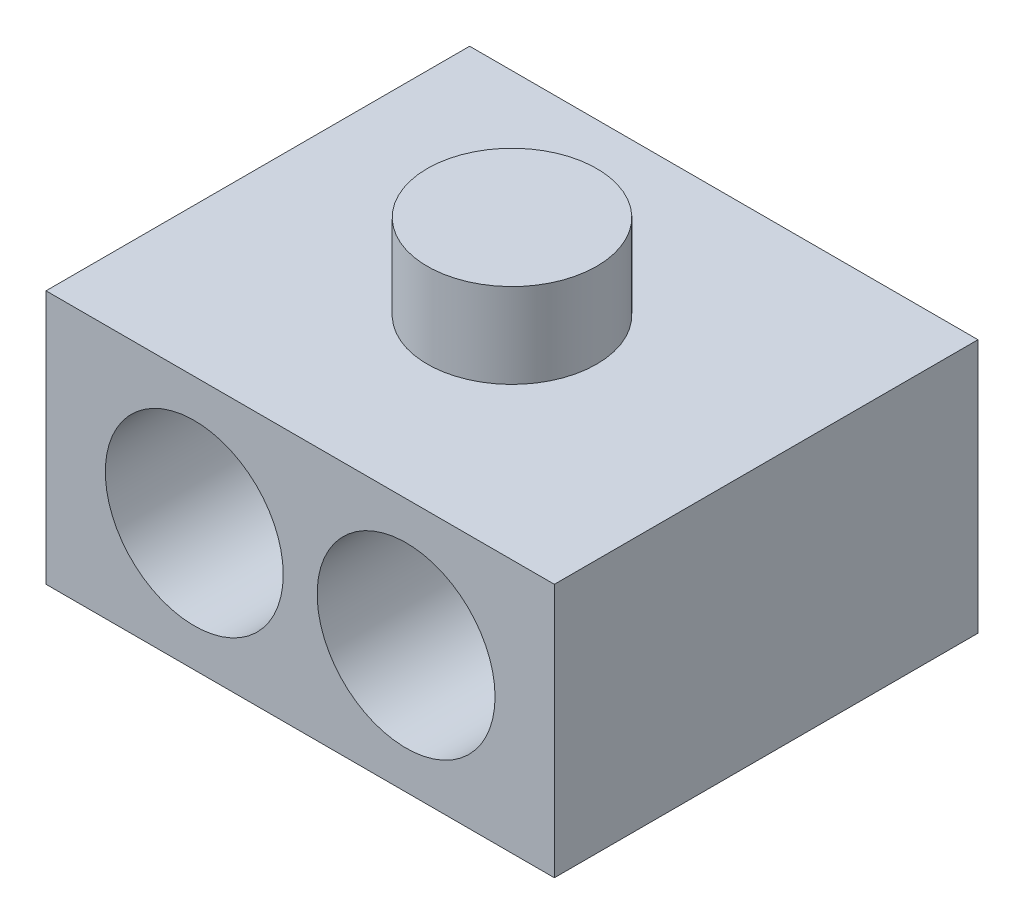
ISO-10303-21;
HEADER;
FILE_DESCRIPTION(('STEP AP214'),'2;1');
FILE_NAME('part.step','',(''),(''),'','','');
FILE_SCHEMA(('AUTOMOTIVE_DESIGN { 1 0 10303 214 1 1 1 1 }'));
ENDSEC;
DATA;
#1=APPLICATION_CONTEXT('core data for automotive mechanical design processes');
#2=APPLICATION_PROTOCOL_DEFINITION('international standard','automotive_design',2000,#1);
#3=PRODUCT_CONTEXT('',#1,'mechanical');
#4=PRODUCT('Part','Part','',(#3));
#5=PRODUCT_RELATED_PRODUCT_CATEGORY('part','',(#4));
#6=PRODUCT_DEFINITION_FORMATION('','',#4);
#7=PRODUCT_DEFINITION_CONTEXT('part definition',#1,'design');
#8=PRODUCT_DEFINITION('design','',#6,#7);
#9=PRODUCT_DEFINITION_SHAPE('','',#8);
#10=(LENGTH_UNIT() NAMED_UNIT(*) SI_UNIT(.MILLI.,.METRE.));
#11=(NAMED_UNIT(*) PLANE_ANGLE_UNIT() SI_UNIT($,.RADIAN.));
#12=(NAMED_UNIT(*) SI_UNIT($,.STERADIAN.) SOLID_ANGLE_UNIT());
#13=UNCERTAINTY_MEASURE_WITH_UNIT(LENGTH_MEASURE(1.E-05),#10,'distance_accuracy_value','');
#14=(GEOMETRIC_REPRESENTATION_CONTEXT(3) GLOBAL_UNCERTAINTY_ASSIGNED_CONTEXT((#13)) GLOBAL_UNIT_ASSIGNED_CONTEXT((#10,
#11,#12)) REPRESENTATION_CONTEXT('',''));
#15=CARTESIAN_POINT('',(0.,0.,0.));
#16=DIRECTION('',(0.,0.,1.));
#17=DIRECTION('',(1.,0.,0.));
#18=AXIS2_PLACEMENT_3D('',#15,#16,#17);
#19=CARTESIAN_POINT('',(0.,30.,10.));
#20=DIRECTION('',(0.,-1.,0.));
#21=DIRECTION('',(1.,0.,0.));
#22=AXIS2_PLACEMENT_3D('',#19,#20,#21);
#23=PLANE('',#22);
#24=CARTESIAN_POINT('',(-25.,30.,25.));
#25=DIRECTION('',(0.,1.,0.));
#26=DIRECTION('',(-1.,0.,0.));
#27=AXIS2_PLACEMENT_3D('',#24,#25,#26);
#28=CIRCLE('',#27,10.);
#29=CARTESIAN_POINT('',(-35.,30.,25.));
#30=VERTEX_POINT('',#29);
#31=EDGE_CURVE('E11',#30,#30,#28,.T.);
#32=ORIENTED_EDGE('',*,*,#31,.F.);
#33=EDGE_LOOP('',(#32));
#34=FACE_BOUND('',#33,.T.);
#35=DIRECTION('',(-1.,0.,0.));
#36=VECTOR('',#35,1.);
#37=CARTESIAN_POINT('',(0.,30.,0.));
#38=LINE('',#37,#36);
#39=CARTESIAN_POINT('',(5.,30.,0.));
#40=VERTEX_POINT('',#39);
#41=CARTESIAN_POINT('',(-55.,30.,0.));
#42=VERTEX_POINT('',#41);
#43=EDGE_CURVE('E56',#40,#42,#38,.T.);
#44=ORIENTED_EDGE('',*,*,#43,.T.);
#45=DIRECTION('',(0.,0.,-1.));
#46=VECTOR('',#45,1.);
#47=CARTESIAN_POINT('',(-55.,30.,0.));
#48=LINE('',#47,#46);
#49=CARTESIAN_POINT('',(-55.,30.,50.));
#50=VERTEX_POINT('',#49);
#51=EDGE_CURVE('E92',#50,#42,#48,.T.);
#52=ORIENTED_EDGE('',*,*,#51,.F.);
#53=DIRECTION('',(-1.,0.,0.));
#54=VECTOR('',#53,1.);
#55=CARTESIAN_POINT('',(-50.,30.,50.));
#56=LINE('',#55,#54);
#57=CARTESIAN_POINT('',(5.,30.,50.));
#58=VERTEX_POINT('',#57);
#59=EDGE_CURVE('E48',#58,#50,#56,.T.);
#60=ORIENTED_EDGE('',*,*,#59,.F.);
#61=DIRECTION('',(0.,0.,1.));
#62=VECTOR('',#61,1.);
#63=CARTESIAN_POINT('',(5.,30.,50.));
#64=LINE('',#63,#62);
#65=EDGE_CURVE('E106',#40,#58,#64,.T.);
#66=ORIENTED_EDGE('',*,*,#65,.F.);
#67=EDGE_LOOP('',(#44,#52,#60,#66));
#68=FACE_BOUND('',#67,.T.);
#69=ADVANCED_FACE('F33',(#34,#68),#23,.F.);
#70=CARTESIAN_POINT('',(0.,0.,10.));
#71=DIRECTION('',(0.,1.,0.));
#72=DIRECTION('',(0.,0.,1.));
#73=AXIS2_PLACEMENT_3D('',#70,#71,#72);
#74=PLANE('',#73);
#75=DIRECTION('',(1.,0.,0.));
#76=VECTOR('',#75,1.);
#77=CARTESIAN_POINT('',(0.,0.,0.));
#78=LINE('',#77,#76);
#79=CARTESIAN_POINT('',(-55.,0.,0.));
#80=VERTEX_POINT('',#79);
#81=CARTESIAN_POINT('',(5.,0.,0.));
#82=VERTEX_POINT('',#81);
#83=EDGE_CURVE('E36',#80,#82,#78,.T.);
#84=ORIENTED_EDGE('',*,*,#83,.T.);
#85=DIRECTION('',(0.,0.,-1.));
#86=VECTOR('',#85,1.);
#87=CARTESIAN_POINT('',(5.,0.,50.));
#88=LINE('',#87,#86);
#89=CARTESIAN_POINT('',(5.,0.,50.));
#90=VERTEX_POINT('',#89);
#91=EDGE_CURVE('E103',#90,#82,#88,.T.);
#92=ORIENTED_EDGE('',*,*,#91,.F.);
#93=DIRECTION('',(1.,0.,0.));
#94=VECTOR('',#93,1.);
#95=CARTESIAN_POINT('',(-50.,0.,50.));
#96=LINE('',#95,#94);
#97=CARTESIAN_POINT('',(-55.,0.,50.));
#98=VERTEX_POINT('',#97);
#99=EDGE_CURVE('E84',#98,#90,#96,.T.);
#100=ORIENTED_EDGE('',*,*,#99,.F.);
#101=DIRECTION('',(0.,0.,1.));
#102=VECTOR('',#101,1.);
#103=CARTESIAN_POINT('',(-55.,0.,0.));
#104=LINE('',#103,#102);
#105=EDGE_CURVE('E82',#80,#98,#104,.T.);
#106=ORIENTED_EDGE('',*,*,#105,.F.);
#107=EDGE_LOOP('',(#84,#92,#100,#106));
#108=FACE_BOUND('',#107,.T.);
#109=ADVANCED_FACE('F83',(#108),#74,.F.);
#110=CARTESIAN_POINT('',(0.,0.,0.));
#111=DIRECTION('',(0.,0.,1.));
#112=DIRECTION('',(1.,0.,0.));
#113=AXIS2_PLACEMENT_3D('',#110,#111,#112);
#114=PLANE('',#113);
#115=CARTESIAN_POINT('',(-37.5,15.,0.));
#116=DIRECTION('',(0.,0.,1.));
#117=DIRECTION('',(1.,0.,0.));
#118=AXIS2_PLACEMENT_3D('',#115,#116,#117);
#119=CIRCLE('',#118,7.5);
#120=CARTESIAN_POINT('',(-30.,15.,0.));
#121=VERTEX_POINT('',#120);
#122=EDGE_CURVE('E125',#121,#121,#119,.T.);
#123=ORIENTED_EDGE('',*,*,#122,.T.);
#124=EDGE_LOOP('',(#123));
#125=FACE_BOUND('',#124,.T.);
#126=CARTESIAN_POINT('',(-12.5,15.,0.));
#127=DIRECTION('',(0.,0.,1.));
#128=DIRECTION('',(1.,0.,0.));
#129=AXIS2_PLACEMENT_3D('',#126,#127,#128);
#130=CIRCLE('',#129,7.5);
#131=CARTESIAN_POINT('',(-5.,15.,0.));
#132=VERTEX_POINT('',#131);
#133=EDGE_CURVE('E124',#132,#132,#130,.T.);
#134=ORIENTED_EDGE('',*,*,#133,.T.);
#135=EDGE_LOOP('',(#134));
#136=FACE_BOUND('',#135,.T.);
#137=ORIENTED_EDGE('',*,*,#43,.F.);
#138=DIRECTION('',(0.,1.,0.));
#139=VECTOR('',#138,1.);
#140=CARTESIAN_POINT('',(5.,30.,0.));
#141=LINE('',#140,#139);
#142=EDGE_CURVE('E77',#82,#40,#141,.T.);
#143=ORIENTED_EDGE('',*,*,#142,.F.);
#144=ORIENTED_EDGE('',*,*,#83,.F.);
#145=DIRECTION('',(0.,-1.,0.));
#146=VECTOR('',#145,1.);
#147=CARTESIAN_POINT('',(-55.,0.,0.));
#148=LINE('',#147,#146);
#149=EDGE_CURVE('E76',#42,#80,#148,.T.);
#150=ORIENTED_EDGE('',*,*,#149,.F.);
#151=EDGE_LOOP('',(#137,#143,#144,#150));
#152=FACE_BOUND('',#151,.T.);
#153=ADVANCED_FACE('F74',(#125,#136,#152),#114,.F.);
#154=CARTESIAN_POINT('',(-12.5,15.,0.));
#155=DIRECTION('',(0.,0.,1.));
#156=DIRECTION('',(1.,0.,0.));
#157=AXIS2_PLACEMENT_3D('',#154,#155,#156);
#158=CYLINDRICAL_SURFACE('',#157,7.5);
#159=ORIENTED_EDGE('',*,*,#133,.F.);
#160=EDGE_LOOP('',(#159));
#161=FACE_BOUND('',#160,.T.);
#162=CARTESIAN_POINT('',(-12.5,15.,10.));
#163=DIRECTION('',(0.,0.,1.));
#164=DIRECTION('',(1.,0.,0.));
#165=AXIS2_PLACEMENT_3D('',#162,#163,#164);
#166=CIRCLE('',#165,7.5);
#167=CARTESIAN_POINT('',(-5.,15.,10.));
#168=VERTEX_POINT('',#167);
#169=EDGE_CURVE('E122',#168,#168,#166,.T.);
#170=ORIENTED_EDGE('',*,*,#169,.T.);
#171=EDGE_LOOP('',(#170));
#172=FACE_BOUND('',#171,.T.);
#173=ADVANCED_FACE('F150',(#161,#172),#158,.F.);
#174=CARTESIAN_POINT('',(-37.5,15.,0.));
#175=DIRECTION('',(0.,0.,1.));
#176=DIRECTION('',(1.,0.,0.));
#177=AXIS2_PLACEMENT_3D('',#174,#175,#176);
#178=CYLINDRICAL_SURFACE('',#177,7.5);
#179=ORIENTED_EDGE('',*,*,#122,.F.);
#180=EDGE_LOOP('',(#179));
#181=FACE_BOUND('',#180,.T.);
#182=CARTESIAN_POINT('',(-37.5,15.,10.));
#183=DIRECTION('',(0.,0.,1.));
#184=DIRECTION('',(1.,0.,0.));
#185=AXIS2_PLACEMENT_3D('',#182,#183,#184);
#186=CIRCLE('',#185,7.5);
#187=CARTESIAN_POINT('',(-30.,15.,10.));
#188=VERTEX_POINT('',#187);
#189=EDGE_CURVE('E112',#188,#188,#186,.T.);
#190=ORIENTED_EDGE('',*,*,#189,.T.);
#191=EDGE_LOOP('',(#190));
#192=FACE_BOUND('',#191,.T.);
#193=ADVANCED_FACE('F140',(#181,#192),#178,.F.);
#194=CARTESIAN_POINT('',(0.,0.,50.));
#195=DIRECTION('',(0.,0.,1.));
#196=DIRECTION('',(1.,0.,0.));
#197=AXIS2_PLACEMENT_3D('',#194,#195,#196);
#198=PLANE('',#197);
#199=CARTESIAN_POINT('',(-37.5,15.,50.));
#200=DIRECTION('',(0.,0.,1.));
#201=DIRECTION('',(1.,0.,0.));
#202=AXIS2_PLACEMENT_3D('',#199,#200,#201);
#203=CIRCLE('',#202,10.5);
#204=CARTESIAN_POINT('',(-27.,15.,50.));
#205=VERTEX_POINT('',#204);
#206=EDGE_CURVE('E113',#205,#205,#203,.T.);
#207=ORIENTED_EDGE('',*,*,#206,.F.);
#208=EDGE_LOOP('',(#207));
#209=FACE_BOUND('',#208,.T.);
#210=CARTESIAN_POINT('',(-12.5,15.,50.));
#211=DIRECTION('',(0.,0.,1.));
#212=DIRECTION('',(1.,0.,0.));
#213=AXIS2_PLACEMENT_3D('',#210,#211,#212);
#214=CIRCLE('',#213,10.5);
#215=CARTESIAN_POINT('',(-2.,15.,50.));
#216=VERTEX_POINT('',#215);
#217=EDGE_CURVE('E108',#216,#216,#214,.T.);
#218=ORIENTED_EDGE('',*,*,#217,.F.);
#219=EDGE_LOOP('',(#218));
#220=FACE_BOUND('',#219,.T.);
#221=ORIENTED_EDGE('',*,*,#59,.T.);
#222=DIRECTION('',(0.,1.,0.));
#223=VECTOR('',#222,1.);
#224=CARTESIAN_POINT('',(-55.,0.,50.));
#225=LINE('',#224,#223);
#226=EDGE_CURVE('E88',#98,#50,#225,.T.);
#227=ORIENTED_EDGE('',*,*,#226,.F.);
#228=ORIENTED_EDGE('',*,*,#99,.T.);
#229=DIRECTION('',(0.,-1.,0.));
#230=VECTOR('',#229,1.);
#231=CARTESIAN_POINT('',(5.,30.,50.));
#232=LINE('',#231,#230);
#233=EDGE_CURVE('E100',#58,#90,#232,.T.);
#234=ORIENTED_EDGE('',*,*,#233,.F.);
#235=EDGE_LOOP('',(#221,#227,#228,#234));
#236=FACE_BOUND('',#235,.T.);
#237=ADVANCED_FACE('F137',(#209,#220,#236),#198,.T.);
#238=CARTESIAN_POINT('',(-12.5,15.,10.));
#239=DIRECTION('',(0.,0.,1.));
#240=DIRECTION('',(1.,0.,0.));
#241=AXIS2_PLACEMENT_3D('',#238,#239,#240);
#242=CYLINDRICAL_SURFACE('',#241,10.5);
#243=CARTESIAN_POINT('',(-12.5,15.,10.));
#244=DIRECTION('',(0.,0.,1.));
#245=DIRECTION('',(1.,0.,0.));
#246=AXIS2_PLACEMENT_3D('',#243,#244,#245);
#247=CIRCLE('',#246,10.5);
#248=CARTESIAN_POINT('',(-2.,15.,10.));
#249=VERTEX_POINT('',#248);
#250=EDGE_CURVE('E116',#249,#249,#247,.T.);
#251=ORIENTED_EDGE('',*,*,#250,.F.);
#252=EDGE_LOOP('',(#251));
#253=FACE_BOUND('',#252,.T.);
#254=ORIENTED_EDGE('',*,*,#217,.T.);
#255=EDGE_LOOP('',(#254));
#256=FACE_BOUND('',#255,.T.);
#257=ADVANCED_FACE('F139',(#253,#256),#242,.F.);
#258=CARTESIAN_POINT('',(-12.5,15.,10.));
#259=DIRECTION('',(0.,0.,1.));
#260=DIRECTION('',(1.,0.,0.));
#261=AXIS2_PLACEMENT_3D('',#258,#259,#260);
#262=PLANE('',#261);
#263=ORIENTED_EDGE('',*,*,#169,.F.);
#264=EDGE_LOOP('',(#263));
#265=FACE_BOUND('',#264,.T.);
#266=ORIENTED_EDGE('',*,*,#250,.T.);
#267=EDGE_LOOP('',(#266));
#268=FACE_BOUND('',#267,.T.);
#269=ADVANCED_FACE('F147',(#265,#268),#262,.T.);
#270=CARTESIAN_POINT('',(-37.5,15.,10.));
#271=DIRECTION('',(0.,0.,1.));
#272=DIRECTION('',(1.,0.,0.));
#273=AXIS2_PLACEMENT_3D('',#270,#271,#272);
#274=CYLINDRICAL_SURFACE('',#273,10.5);
#275=CARTESIAN_POINT('',(-37.5,15.,10.));
#276=DIRECTION('',(0.,0.,1.));
#277=DIRECTION('',(1.,0.,0.));
#278=AXIS2_PLACEMENT_3D('',#275,#276,#277);
#279=CIRCLE('',#278,10.5);
#280=CARTESIAN_POINT('',(-27.,15.,10.));
#281=VERTEX_POINT('',#280);
#282=EDGE_CURVE('E109',#281,#281,#279,.T.);
#283=ORIENTED_EDGE('',*,*,#282,.F.);
#284=EDGE_LOOP('',(#283));
#285=FACE_BOUND('',#284,.T.);
#286=ORIENTED_EDGE('',*,*,#206,.T.);
#287=EDGE_LOOP('',(#286));
#288=FACE_BOUND('',#287,.T.);
#289=ADVANCED_FACE('F181',(#285,#288),#274,.F.);
#290=CARTESIAN_POINT('',(-37.5,15.,10.));
#291=DIRECTION('',(0.,0.,1.));
#292=DIRECTION('',(1.,0.,0.));
#293=AXIS2_PLACEMENT_3D('',#290,#291,#292);
#294=PLANE('',#293);
#295=ORIENTED_EDGE('',*,*,#189,.F.);
#296=EDGE_LOOP('',(#295));
#297=FACE_BOUND('',#296,.T.);
#298=ORIENTED_EDGE('',*,*,#282,.T.);
#299=EDGE_LOOP('',(#298));
#300=FACE_BOUND('',#299,.T.);
#301=ADVANCED_FACE('F178',(#297,#300),#294,.T.);
#302=CARTESIAN_POINT('',(5.,0.,0.));
#303=DIRECTION('',(1.,0.,0.));
#304=DIRECTION('',(0.,0.,-1.));
#305=AXIS2_PLACEMENT_3D('',#302,#303,#304);
#306=PLANE('',#305);
#307=ORIENTED_EDGE('',*,*,#233,.T.);
#308=ORIENTED_EDGE('',*,*,#91,.T.);
#309=ORIENTED_EDGE('',*,*,#142,.T.);
#310=ORIENTED_EDGE('',*,*,#65,.T.);
#311=EDGE_LOOP('',(#307,#308,#309,#310));
#312=FACE_BOUND('',#311,.T.);
#313=ADVANCED_FACE('F135',(#312),#306,.T.);
#314=CARTESIAN_POINT('',(-55.,0.,0.));
#315=DIRECTION('',(1.,0.,0.));
#316=DIRECTION('',(0.,0.,-1.));
#317=AXIS2_PLACEMENT_3D('',#314,#315,#316);
#318=PLANE('',#317);
#319=ORIENTED_EDGE('',*,*,#149,.T.);
#320=ORIENTED_EDGE('',*,*,#105,.T.);
#321=ORIENTED_EDGE('',*,*,#226,.T.);
#322=ORIENTED_EDGE('',*,*,#51,.T.);
#323=EDGE_LOOP('',(#319,#320,#321,#322));
#324=FACE_BOUND('',#323,.T.);
#325=ADVANCED_FACE('F91',(#324),#318,.F.);
#326=CARTESIAN_POINT('',(-25.,40.,25.));
#327=DIRECTION('',(0.,-1.,0.));
#328=DIRECTION('',(1.,0.,0.));
#329=AXIS2_PLACEMENT_3D('',#326,#327,#328);
#330=CYLINDRICAL_SURFACE('',#329,10.);
#331=CARTESIAN_POINT('',(-25.,40.,25.));
#332=DIRECTION('',(0.,1.,0.));
#333=DIRECTION('',(-1.,0.,0.));
#334=AXIS2_PLACEMENT_3D('',#331,#332,#333);
#335=CIRCLE('',#334,10.);
#336=CARTESIAN_POINT('',(-35.,40.,25.));
#337=VERTEX_POINT('',#336);
#338=EDGE_CURVE('E93',#337,#337,#335,.T.);
#339=ORIENTED_EDGE('',*,*,#338,.F.);
#340=EDGE_LOOP('',(#339));
#341=FACE_BOUND('',#340,.T.);
#342=ORIENTED_EDGE('',*,*,#31,.T.);
#343=EDGE_LOOP('',(#342));
#344=FACE_BOUND('',#343,.T.);
#345=ADVANCED_FACE('F162',(#341,#344),#330,.T.);
#346=CARTESIAN_POINT('',(-25.,40.,25.));
#347=DIRECTION('',(0.,1.,0.));
#348=DIRECTION('',(-1.,0.,0.));
#349=AXIS2_PLACEMENT_3D('',#346,#347,#348);
#350=PLANE('',#349);
#351=ORIENTED_EDGE('',*,*,#338,.T.);
#352=EDGE_LOOP('',(#351));
#353=FACE_BOUND('',#352,.T.);
#354=ADVANCED_FACE('F164',(#353),#350,.T.);
#355=CLOSED_SHELL('',(#69,#109,#153,#173,#193,#237,#257,#269,#289,#301,#313,#325,#345,#354));
#356=MANIFOLD_SOLID_BREP('B2',#355);
#357=ADVANCED_BREP_SHAPE_REPRESENTATION('',(#18,#356),#14);
#358=SHAPE_DEFINITION_REPRESENTATION(#9,#357);
ENDSEC;
END-ISO-10303-21;
